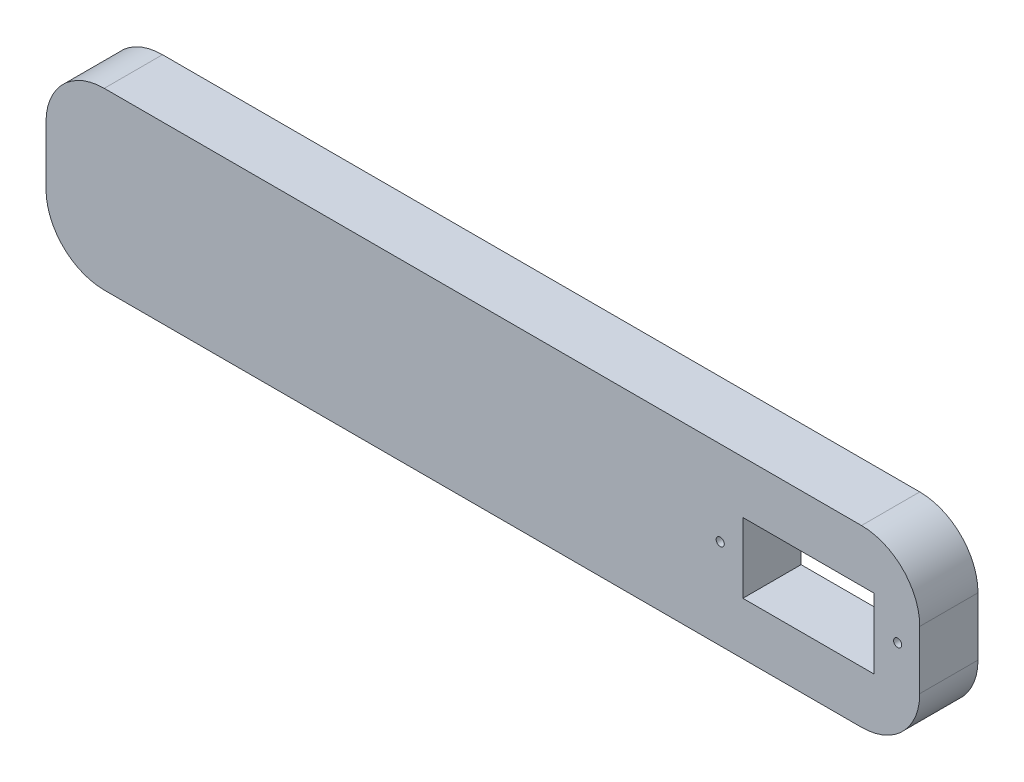
ISO-10303-21;
HEADER;
FILE_DESCRIPTION(('STEP AP214'),'2;1');
FILE_NAME('part.step','',(''),(''),'','','');
FILE_SCHEMA(('AUTOMOTIVE_DESIGN { 1 0 10303 214 1 1 1 1 }'));
ENDSEC;
DATA;
#1=APPLICATION_CONTEXT('core data for automotive mechanical design processes');
#2=APPLICATION_PROTOCOL_DEFINITION('international standard','automotive_design',2000,#1);
#3=PRODUCT_CONTEXT('',#1,'mechanical');
#4=PRODUCT('Part','Part','',(#3));
#5=PRODUCT_RELATED_PRODUCT_CATEGORY('part','',(#4));
#6=PRODUCT_DEFINITION_FORMATION('','',#4);
#7=PRODUCT_DEFINITION_CONTEXT('part definition',#1,'design');
#8=PRODUCT_DEFINITION('design','',#6,#7);
#9=PRODUCT_DEFINITION_SHAPE('','',#8);
#10=(LENGTH_UNIT() NAMED_UNIT(*) SI_UNIT(.MILLI.,.METRE.));
#11=(NAMED_UNIT(*) PLANE_ANGLE_UNIT() SI_UNIT($,.RADIAN.));
#12=(NAMED_UNIT(*) SI_UNIT($,.STERADIAN.) SOLID_ANGLE_UNIT());
#13=UNCERTAINTY_MEASURE_WITH_UNIT(LENGTH_MEASURE(1.E-05),#10,'distance_accuracy_value','');
#14=(GEOMETRIC_REPRESENTATION_CONTEXT(3) GLOBAL_UNCERTAINTY_ASSIGNED_CONTEXT((#13)) GLOBAL_UNIT_ASSIGNED_CONTEXT((#10,
#11,#12)) REPRESENTATION_CONTEXT('',''));
#15=CARTESIAN_POINT('',(0.,0.,0.));
#16=DIRECTION('',(0.,0.,1.));
#17=DIRECTION('',(1.,0.,0.));
#18=AXIS2_PLACEMENT_3D('',#15,#16,#17);
#19=CARTESIAN_POINT('',(10.,10.,10.));
#20=DIRECTION('',(0.,0.,-1.));
#21=DIRECTION('',(-1.,0.,0.));
#22=AXIS2_PLACEMENT_3D('',#19,#20,#21);
#23=CYLINDRICAL_SURFACE('',#22,10.);
#24=CARTESIAN_POINT('',(10.,10.,0.));
#25=DIRECTION('',(0.,0.,-1.));
#26=DIRECTION('',(-1.,0.,0.));
#27=AXIS2_PLACEMENT_3D('',#24,#25,#26);
#28=CIRCLE('',#27,10.);
#29=CARTESIAN_POINT('',(10.0000000000001,0.,0.));
#30=VERTEX_POINT('',#29);
#31=CARTESIAN_POINT('',(0.,10.0000000000001,0.));
#32=VERTEX_POINT('',#31);
#33=EDGE_CURVE('E163',#30,#32,#28,.T.);
#34=ORIENTED_EDGE('',*,*,#33,.F.);
#35=DIRECTION('',(0.,0.,-1.));
#36=VECTOR('',#35,1.);
#37=CARTESIAN_POINT('',(10.0000000000001,0.,10.));
#38=LINE('',#37,#36);
#39=CARTESIAN_POINT('',(10.0000000000001,0.,10.));
#40=VERTEX_POINT('',#39);
#41=EDGE_CURVE('E11',#40,#30,#38,.T.);
#42=ORIENTED_EDGE('',*,*,#41,.F.);
#43=CARTESIAN_POINT('',(10.,10.,10.));
#44=DIRECTION('',(0.,0.,-1.));
#45=DIRECTION('',(-1.,0.,0.));
#46=AXIS2_PLACEMENT_3D('',#43,#44,#45);
#47=CIRCLE('',#46,10.);
#48=CARTESIAN_POINT('',(0.,10.0000000000001,10.));
#49=VERTEX_POINT('',#48);
#50=EDGE_CURVE('E169',#40,#49,#47,.T.);
#51=ORIENTED_EDGE('',*,*,#50,.T.);
#52=DIRECTION('',(0.,0.,-1.));
#53=VECTOR('',#52,1.);
#54=CARTESIAN_POINT('',(0.,10.0000000000001,10.));
#55=LINE('',#54,#53);
#56=EDGE_CURVE('E45',#49,#32,#55,.T.);
#57=ORIENTED_EDGE('',*,*,#56,.T.);
#58=EDGE_LOOP('',(#34,#42,#51,#57));
#59=FACE_BOUND('',#58,.T.);
#60=ADVANCED_FACE('F39',(#59),#23,.T.);
#61=CARTESIAN_POINT('',(10.0000000000001,0.,10.));
#62=DIRECTION('',(0.,1.,0.));
#63=DIRECTION('',(0.,0.,1.));
#64=AXIS2_PLACEMENT_3D('',#61,#62,#63);
#65=PLANE('',#64);
#66=DIRECTION('',(1.,0.,0.));
#67=VECTOR('',#66,1.);
#68=CARTESIAN_POINT('',(10.0000000000001,0.,0.));
#69=LINE('',#68,#67);
#70=CARTESIAN_POINT('',(140.,0.,0.));
#71=VERTEX_POINT('',#70);
#72=EDGE_CURVE('E175',#30,#71,#69,.T.);
#73=ORIENTED_EDGE('',*,*,#72,.T.);
#74=DIRECTION('',(0.,0.,-1.));
#75=VECTOR('',#74,1.);
#76=CARTESIAN_POINT('',(140.,0.,10.));
#77=LINE('',#76,#75);
#78=CARTESIAN_POINT('',(140.,0.,10.));
#79=VERTEX_POINT('',#78);
#80=EDGE_CURVE('E50',#79,#71,#77,.T.);
#81=ORIENTED_EDGE('',*,*,#80,.F.);
#82=DIRECTION('',(1.,0.,0.));
#83=VECTOR('',#82,1.);
#84=CARTESIAN_POINT('',(10.0000000000001,0.,10.));
#85=LINE('',#84,#83);
#86=EDGE_CURVE('E187',#40,#79,#85,.T.);
#87=ORIENTED_EDGE('',*,*,#86,.F.);
#88=ORIENTED_EDGE('',*,*,#41,.T.);
#89=EDGE_LOOP('',(#73,#81,#87,#88));
#90=FACE_BOUND('',#89,.T.);
#91=ADVANCED_FACE('F237',(#90),#65,.F.);
#92=CARTESIAN_POINT('',(140.,10.,10.));
#93=DIRECTION('',(0.,0.,-1.));
#94=DIRECTION('',(-1.,0.,0.));
#95=AXIS2_PLACEMENT_3D('',#92,#93,#94);
#96=CYLINDRICAL_SURFACE('',#95,10.);
#97=CARTESIAN_POINT('',(140.,10.,0.));
#98=DIRECTION('',(0.,0.,1.));
#99=DIRECTION('',(1.,0.,0.));
#100=AXIS2_PLACEMENT_3D('',#97,#98,#99);
#101=CIRCLE('',#100,10.);
#102=CARTESIAN_POINT('',(150.,10.0000000000001,0.));
#103=VERTEX_POINT('',#102);
#104=EDGE_CURVE('E210',#71,#103,#101,.T.);
#105=ORIENTED_EDGE('',*,*,#104,.T.);
#106=DIRECTION('',(0.,0.,-1.));
#107=VECTOR('',#106,1.);
#108=CARTESIAN_POINT('',(150.,10.0000000000001,10.));
#109=LINE('',#108,#107);
#110=CARTESIAN_POINT('',(150.,10.0000000000001,10.));
#111=VERTEX_POINT('',#110);
#112=EDGE_CURVE('E215',#111,#103,#109,.T.);
#113=ORIENTED_EDGE('',*,*,#112,.F.);
#114=CARTESIAN_POINT('',(140.,10.,10.));
#115=DIRECTION('',(0.,0.,1.));
#116=DIRECTION('',(1.,0.,0.));
#117=AXIS2_PLACEMENT_3D('',#114,#115,#116);
#118=CIRCLE('',#117,10.);
#119=EDGE_CURVE('E186',#79,#111,#118,.T.);
#120=ORIENTED_EDGE('',*,*,#119,.F.);
#121=ORIENTED_EDGE('',*,*,#80,.T.);
#122=EDGE_LOOP('',(#105,#113,#120,#121));
#123=FACE_BOUND('',#122,.T.);
#124=ADVANCED_FACE('F238',(#123),#96,.T.);
#125=CARTESIAN_POINT('',(150.,10.0000000000001,10.));
#126=DIRECTION('',(-1.,0.,0.));
#127=DIRECTION('',(0.,0.,1.));
#128=AXIS2_PLACEMENT_3D('',#125,#126,#127);
#129=PLANE('',#128);
#130=DIRECTION('',(0.,1.,0.));
#131=VECTOR('',#130,1.);
#132=CARTESIAN_POINT('',(150.,10.0000000000001,0.));
#133=LINE('',#132,#131);
#134=CARTESIAN_POINT('',(150.,20.,0.));
#135=VERTEX_POINT('',#134);
#136=EDGE_CURVE('E204',#103,#135,#133,.T.);
#137=ORIENTED_EDGE('',*,*,#136,.T.);
#138=DIRECTION('',(0.,0.,-1.));
#139=VECTOR('',#138,1.);
#140=CARTESIAN_POINT('',(150.,20.,10.));
#141=LINE('',#140,#139);
#142=CARTESIAN_POINT('',(150.,20.,10.));
#143=VERTEX_POINT('',#142);
#144=EDGE_CURVE('E214',#143,#135,#141,.T.);
#145=ORIENTED_EDGE('',*,*,#144,.F.);
#146=DIRECTION('',(0.,1.,0.));
#147=VECTOR('',#146,1.);
#148=CARTESIAN_POINT('',(150.,10.0000000000001,10.));
#149=LINE('',#148,#147);
#150=EDGE_CURVE('E184',#111,#143,#149,.T.);
#151=ORIENTED_EDGE('',*,*,#150,.F.);
#152=ORIENTED_EDGE('',*,*,#112,.T.);
#153=EDGE_LOOP('',(#137,#145,#151,#152));
#154=FACE_BOUND('',#153,.T.);
#155=ADVANCED_FACE('F258',(#154),#129,.F.);
#156=CARTESIAN_POINT('',(140.,20.,10.));
#157=DIRECTION('',(0.,0.,-1.));
#158=DIRECTION('',(-1.,0.,0.));
#159=AXIS2_PLACEMENT_3D('',#156,#157,#158);
#160=CYLINDRICAL_SURFACE('',#159,10.);
#161=CARTESIAN_POINT('',(140.,20.,0.));
#162=DIRECTION('',(0.,0.,-1.));
#163=DIRECTION('',(-1.,0.,0.));
#164=AXIS2_PLACEMENT_3D('',#161,#162,#163);
#165=CIRCLE('',#164,10.);
#166=CARTESIAN_POINT('',(140.,30.,0.));
#167=VERTEX_POINT('',#166);
#168=EDGE_CURVE('E203',#167,#135,#165,.T.);
#169=ORIENTED_EDGE('',*,*,#168,.F.);
#170=DIRECTION('',(0.,0.,-1.));
#171=VECTOR('',#170,1.);
#172=CARTESIAN_POINT('',(140.,30.,10.));
#173=LINE('',#172,#171);
#174=CARTESIAN_POINT('',(140.,30.,10.));
#175=VERTEX_POINT('',#174);
#176=EDGE_CURVE('E220',#175,#167,#173,.T.);
#177=ORIENTED_EDGE('',*,*,#176,.F.);
#178=CARTESIAN_POINT('',(140.,20.,10.));
#179=DIRECTION('',(0.,0.,-1.));
#180=DIRECTION('',(-1.,0.,0.));
#181=AXIS2_PLACEMENT_3D('',#178,#179,#180);
#182=CIRCLE('',#181,10.);
#183=EDGE_CURVE('E182',#175,#143,#182,.T.);
#184=ORIENTED_EDGE('',*,*,#183,.T.);
#185=ORIENTED_EDGE('',*,*,#144,.T.);
#186=EDGE_LOOP('',(#169,#177,#184,#185));
#187=FACE_BOUND('',#186,.T.);
#188=ADVANCED_FACE('F255',(#187),#160,.T.);
#189=CARTESIAN_POINT('',(10.,30.,10.));
#190=DIRECTION('',(0.,1.,0.));
#191=DIRECTION('',(0.,0.,1.));
#192=AXIS2_PLACEMENT_3D('',#189,#190,#191);
#193=PLANE('',#192);
#194=DIRECTION('',(1.,0.,0.));
#195=VECTOR('',#194,1.);
#196=CARTESIAN_POINT('',(10.,30.,0.));
#197=LINE('',#196,#195);
#198=CARTESIAN_POINT('',(10.,30.,0.));
#199=VERTEX_POINT('',#198);
#200=EDGE_CURVE('E196',#199,#167,#197,.T.);
#201=ORIENTED_EDGE('',*,*,#200,.F.);
#202=DIRECTION('',(0.,0.,-1.));
#203=VECTOR('',#202,1.);
#204=CARTESIAN_POINT('',(10.,30.,10.));
#205=LINE('',#204,#203);
#206=CARTESIAN_POINT('',(10.,30.,10.));
#207=VERTEX_POINT('',#206);
#208=EDGE_CURVE('E218',#207,#199,#205,.T.);
#209=ORIENTED_EDGE('',*,*,#208,.F.);
#210=DIRECTION('',(1.,0.,0.));
#211=VECTOR('',#210,1.);
#212=CARTESIAN_POINT('',(10.,30.,10.));
#213=LINE('',#212,#211);
#214=EDGE_CURVE('E179',#207,#175,#213,.T.);
#215=ORIENTED_EDGE('',*,*,#214,.T.);
#216=ORIENTED_EDGE('',*,*,#176,.T.);
#217=EDGE_LOOP('',(#201,#209,#215,#216));
#218=FACE_BOUND('',#217,.T.);
#219=ADVANCED_FACE('F252',(#218),#193,.T.);
#220=CARTESIAN_POINT('',(10.,20.,10.));
#221=DIRECTION('',(0.,0.,-1.));
#222=DIRECTION('',(-1.,0.,0.));
#223=AXIS2_PLACEMENT_3D('',#220,#221,#222);
#224=CYLINDRICAL_SURFACE('',#223,10.);
#225=CARTESIAN_POINT('',(10.,20.,0.));
#226=DIRECTION('',(0.,0.,-1.));
#227=DIRECTION('',(-1.,0.,0.));
#228=AXIS2_PLACEMENT_3D('',#225,#226,#227);
#229=CIRCLE('',#228,10.);
#230=CARTESIAN_POINT('',(0.,20.,0.));
#231=VERTEX_POINT('',#230);
#232=EDGE_CURVE('E195',#231,#199,#229,.T.);
#233=ORIENTED_EDGE('',*,*,#232,.F.);
#234=DIRECTION('',(0.,0.,-1.));
#235=VECTOR('',#234,1.);
#236=CARTESIAN_POINT('',(0.,20.,10.));
#237=LINE('',#236,#235);
#238=CARTESIAN_POINT('',(0.,20.,10.));
#239=VERTEX_POINT('',#238);
#240=EDGE_CURVE('E219',#239,#231,#237,.T.);
#241=ORIENTED_EDGE('',*,*,#240,.F.);
#242=CARTESIAN_POINT('',(10.,20.,10.));
#243=DIRECTION('',(0.,0.,-1.));
#244=DIRECTION('',(-1.,0.,0.));
#245=AXIS2_PLACEMENT_3D('',#242,#243,#244);
#246=CIRCLE('',#245,10.);
#247=EDGE_CURVE('E174',#239,#207,#246,.T.);
#248=ORIENTED_EDGE('',*,*,#247,.T.);
#249=ORIENTED_EDGE('',*,*,#208,.T.);
#250=EDGE_LOOP('',(#233,#241,#248,#249));
#251=FACE_BOUND('',#250,.T.);
#252=ADVANCED_FACE('F249',(#251),#224,.T.);
#253=CARTESIAN_POINT('',(0.,10.0000000000001,10.));
#254=DIRECTION('',(-1.,0.,0.));
#255=DIRECTION('',(0.,-1.,0.));
#256=AXIS2_PLACEMENT_3D('',#253,#254,#255);
#257=PLANE('',#256);
#258=DIRECTION('',(0.,1.,0.));
#259=VECTOR('',#258,1.);
#260=CARTESIAN_POINT('',(0.,10.0000000000001,0.));
#261=LINE('',#260,#259);
#262=EDGE_CURVE('E192',#32,#231,#261,.T.);
#263=ORIENTED_EDGE('',*,*,#262,.F.);
#264=ORIENTED_EDGE('',*,*,#56,.F.);
#265=DIRECTION('',(0.,1.,0.));
#266=VECTOR('',#265,1.);
#267=CARTESIAN_POINT('',(0.,10.0000000000001,10.));
#268=LINE('',#267,#266);
#269=EDGE_CURVE('E171',#49,#239,#268,.T.);
#270=ORIENTED_EDGE('',*,*,#269,.T.);
#271=ORIENTED_EDGE('',*,*,#240,.T.);
#272=EDGE_LOOP('',(#263,#264,#270,#271));
#273=FACE_BOUND('',#272,.T.);
#274=ADVANCED_FACE('F227',(#273),#257,.T.);
#275=CARTESIAN_POINT('',(10.,10.,10.));
#276=DIRECTION('',(0.,0.,-1.));
#277=DIRECTION('',(-1.,0.,0.));
#278=AXIS2_PLACEMENT_3D('',#275,#276,#277);
#279=PLANE('',#278);
#280=CARTESIAN_POINT('',(146.209359197237,15.6683609351606,10.));
#281=DIRECTION('',(0.,0.,-1.));
#282=DIRECTION('',(-1.,0.,0.));
#283=AXIS2_PLACEMENT_3D('',#280,#281,#282);
#284=CIRCLE('',#283,0.698499999999991);
#285=CARTESIAN_POINT('',(145.510859197237,15.6683609351606,10.));
#286=VERTEX_POINT('',#285);
#287=EDGE_CURVE('E327',#286,#286,#284,.T.);
#288=ORIENTED_EDGE('',*,*,#287,.T.);
#289=EDGE_LOOP('',(#288));
#290=FACE_BOUND('',#289,.T.);
#291=CARTESIAN_POINT('',(115.743972014608,15.4538159550012,10.));
#292=DIRECTION('',(0.,0.,-1.));
#293=DIRECTION('',(-1.,0.,0.));
#294=AXIS2_PLACEMENT_3D('',#291,#292,#293);
#295=CIRCLE('',#294,0.698499999999991);
#296=CARTESIAN_POINT('',(115.045472014608,15.4538159550012,10.));
#297=VERTEX_POINT('',#296);
#298=EDGE_CURVE('E155',#297,#297,#295,.T.);
#299=ORIENTED_EDGE('',*,*,#298,.T.);
#300=EDGE_LOOP('',(#299));
#301=FACE_BOUND('',#300,.T.);
#302=DIRECTION('',(1.,0.,0.));
#303=VECTOR('',#302,1.);
#304=CARTESIAN_POINT('',(142.152658662093,21.0165694682676,10.));
#305=LINE('',#304,#303);
#306=CARTESIAN_POINT('',(119.632658662093,21.0165694682676,10.));
#307=VERTEX_POINT('',#306);
#308=CARTESIAN_POINT('',(142.152658662093,21.0165694682676,10.));
#309=VERTEX_POINT('',#308);
#310=EDGE_CURVE('E136',#307,#309,#305,.T.);
#311=ORIENTED_EDGE('',*,*,#310,.T.);
#312=DIRECTION('',(0.,-1.,0.));
#313=VECTOR('',#312,1.);
#314=CARTESIAN_POINT('',(142.152658662093,8.99656946826759,10.));
#315=LINE('',#314,#313);
#316=CARTESIAN_POINT('',(142.152658662093,8.99656946826759,10.));
#317=VERTEX_POINT('',#316);
#318=EDGE_CURVE('E128',#309,#317,#315,.T.);
#319=ORIENTED_EDGE('',*,*,#318,.T.);
#320=DIRECTION('',(-1.,0.,0.));
#321=VECTOR('',#320,1.);
#322=CARTESIAN_POINT('',(142.152658662093,8.99656946826759,10.));
#323=LINE('',#322,#321);
#324=CARTESIAN_POINT('',(119.632658662093,8.99656946826759,10.));
#325=VERTEX_POINT('',#324);
#326=EDGE_CURVE('E138',#317,#325,#323,.T.);
#327=ORIENTED_EDGE('',*,*,#326,.T.);
#328=DIRECTION('',(0.,1.,0.));
#329=VECTOR('',#328,1.);
#330=CARTESIAN_POINT('',(119.632658662093,8.99656946826759,10.));
#331=LINE('',#330,#329);
#332=EDGE_CURVE('E54',#325,#307,#331,.T.);
#333=ORIENTED_EDGE('',*,*,#332,.T.);
#334=EDGE_LOOP('',(#311,#319,#327,#333));
#335=FACE_BOUND('',#334,.T.);
#336=ORIENTED_EDGE('',*,*,#50,.F.);
#337=ORIENTED_EDGE('',*,*,#86,.T.);
#338=ORIENTED_EDGE('',*,*,#119,.T.);
#339=ORIENTED_EDGE('',*,*,#150,.T.);
#340=ORIENTED_EDGE('',*,*,#183,.F.);
#341=ORIENTED_EDGE('',*,*,#214,.F.);
#342=ORIENTED_EDGE('',*,*,#247,.F.);
#343=ORIENTED_EDGE('',*,*,#269,.F.);
#344=EDGE_LOOP('',(#336,#337,#338,#339,#340,#341,#342,#343));
#345=FACE_BOUND('',#344,.T.);
#346=ADVANCED_FACE('F141',(#290,#301,#335,#345),#279,.F.);
#347=CARTESIAN_POINT('',(10.,10.,0.));
#348=DIRECTION('',(0.,0.,-1.));
#349=DIRECTION('',(-1.,0.,0.));
#350=AXIS2_PLACEMENT_3D('',#347,#348,#349);
#351=PLANE('',#350);
#352=CARTESIAN_POINT('',(146.209359197237,15.6683609351606,0.));
#353=DIRECTION('',(0.,0.,-1.));
#354=DIRECTION('',(-1.,0.,0.));
#355=AXIS2_PLACEMENT_3D('',#352,#353,#354);
#356=CIRCLE('',#355,1.58749999999999);
#357=CARTESIAN_POINT('',(144.621859197237,15.6683609351606,0.));
#358=VERTEX_POINT('',#357);
#359=EDGE_CURVE('E321',#358,#358,#356,.T.);
#360=ORIENTED_EDGE('',*,*,#359,.F.);
#361=EDGE_LOOP('',(#360));
#362=FACE_BOUND('',#361,.T.);
#363=CARTESIAN_POINT('',(115.743972014608,15.4538159550012,0.));
#364=DIRECTION('',(0.,0.,-1.));
#365=DIRECTION('',(-1.,0.,0.));
#366=AXIS2_PLACEMENT_3D('',#363,#364,#365);
#367=CIRCLE('',#366,1.58749999999999);
#368=CARTESIAN_POINT('',(114.156472014608,15.4538159550012,0.));
#369=VERTEX_POINT('',#368);
#370=EDGE_CURVE('E332',#369,#369,#367,.T.);
#371=ORIENTED_EDGE('',*,*,#370,.F.);
#372=EDGE_LOOP('',(#371));
#373=FACE_BOUND('',#372,.T.);
#374=DIRECTION('',(0.,-1.,0.));
#375=VECTOR('',#374,1.);
#376=CARTESIAN_POINT('',(142.152658662093,8.99656946826759,0.));
#377=LINE('',#376,#375);
#378=CARTESIAN_POINT('',(142.152658662093,21.0165694682676,0.));
#379=VERTEX_POINT('',#378);
#380=CARTESIAN_POINT('',(142.152658662093,8.99656946826759,0.));
#381=VERTEX_POINT('',#380);
#382=EDGE_CURVE('E62',#379,#381,#377,.T.);
#383=ORIENTED_EDGE('',*,*,#382,.F.);
#384=DIRECTION('',(1.,0.,0.));
#385=VECTOR('',#384,1.);
#386=CARTESIAN_POINT('',(142.152658662093,21.0165694682676,0.));
#387=LINE('',#386,#385);
#388=CARTESIAN_POINT('',(119.632658662093,21.0165694682676,0.));
#389=VERTEX_POINT('',#388);
#390=EDGE_CURVE('E148',#389,#379,#387,.T.);
#391=ORIENTED_EDGE('',*,*,#390,.F.);
#392=DIRECTION('',(0.,1.,0.));
#393=VECTOR('',#392,1.);
#394=CARTESIAN_POINT('',(119.632658662093,8.99656946826759,0.));
#395=LINE('',#394,#393);
#396=CARTESIAN_POINT('',(119.632658662093,8.99656946826759,0.));
#397=VERTEX_POINT('',#396);
#398=EDGE_CURVE('E149',#397,#389,#395,.T.);
#399=ORIENTED_EDGE('',*,*,#398,.F.);
#400=DIRECTION('',(-1.,0.,0.));
#401=VECTOR('',#400,1.);
#402=CARTESIAN_POINT('',(142.152658662093,8.99656946826759,0.));
#403=LINE('',#402,#401);
#404=EDGE_CURVE('E158',#381,#397,#403,.T.);
#405=ORIENTED_EDGE('',*,*,#404,.F.);
#406=EDGE_LOOP('',(#383,#391,#399,#405));
#407=FACE_BOUND('',#406,.T.);
#408=ORIENTED_EDGE('',*,*,#33,.T.);
#409=ORIENTED_EDGE('',*,*,#262,.T.);
#410=ORIENTED_EDGE('',*,*,#232,.T.);
#411=ORIENTED_EDGE('',*,*,#200,.T.);
#412=ORIENTED_EDGE('',*,*,#168,.T.);
#413=ORIENTED_EDGE('',*,*,#136,.F.);
#414=ORIENTED_EDGE('',*,*,#104,.F.);
#415=ORIENTED_EDGE('',*,*,#72,.F.);
#416=EDGE_LOOP('',(#408,#409,#410,#411,#412,#413,#414,#415));
#417=FACE_BOUND('',#416,.T.);
#418=ADVANCED_FACE('F231',(#362,#373,#407,#417),#351,.T.);
#419=CARTESIAN_POINT('',(142.152658662093,8.99656946826759,10.));
#420=DIRECTION('',(1.,0.,0.));
#421=DIRECTION('',(0.,0.,-1.));
#422=AXIS2_PLACEMENT_3D('',#419,#420,#421);
#423=PLANE('',#422);
#424=ORIENTED_EDGE('',*,*,#382,.T.);
#425=DIRECTION('',(0.,0.,-1.));
#426=VECTOR('',#425,1.);
#427=CARTESIAN_POINT('',(142.152658662093,8.99656946826759,10.));
#428=LINE('',#427,#426);
#429=EDGE_CURVE('E127',#317,#381,#428,.T.);
#430=ORIENTED_EDGE('',*,*,#429,.F.);
#431=ORIENTED_EDGE('',*,*,#318,.F.);
#432=DIRECTION('',(0.,0.,-1.));
#433=VECTOR('',#432,1.);
#434=CARTESIAN_POINT('',(142.152658662093,21.0165694682676,10.));
#435=LINE('',#434,#433);
#436=EDGE_CURVE('E165',#309,#379,#435,.T.);
#437=ORIENTED_EDGE('',*,*,#436,.T.);
#438=EDGE_LOOP('',(#424,#430,#431,#437));
#439=FACE_BOUND('',#438,.T.);
#440=ADVANCED_FACE('F126',(#439),#423,.F.);
#441=CARTESIAN_POINT('',(142.152658662093,21.0165694682676,10.));
#442=DIRECTION('',(0.,1.,0.));
#443=DIRECTION('',(0.,0.,1.));
#444=AXIS2_PLACEMENT_3D('',#441,#442,#443);
#445=PLANE('',#444);
#446=ORIENTED_EDGE('',*,*,#390,.T.);
#447=ORIENTED_EDGE('',*,*,#436,.F.);
#448=ORIENTED_EDGE('',*,*,#310,.F.);
#449=DIRECTION('',(0.,0.,-1.));
#450=VECTOR('',#449,1.);
#451=CARTESIAN_POINT('',(119.632658662093,21.0165694682676,10.));
#452=LINE('',#451,#450);
#453=EDGE_CURVE('E164',#307,#389,#452,.T.);
#454=ORIENTED_EDGE('',*,*,#453,.T.);
#455=EDGE_LOOP('',(#446,#447,#448,#454));
#456=FACE_BOUND('',#455,.T.);
#457=ADVANCED_FACE('F281',(#456),#445,.F.);
#458=CARTESIAN_POINT('',(119.632658662093,8.99656946826759,10.));
#459=DIRECTION('',(-1.,0.,0.));
#460=DIRECTION('',(0.,0.,1.));
#461=AXIS2_PLACEMENT_3D('',#458,#459,#460);
#462=PLANE('',#461);
#463=ORIENTED_EDGE('',*,*,#398,.T.);
#464=ORIENTED_EDGE('',*,*,#453,.F.);
#465=ORIENTED_EDGE('',*,*,#332,.F.);
#466=DIRECTION('',(0.,0.,-1.));
#467=VECTOR('',#466,1.);
#468=CARTESIAN_POINT('',(119.632658662093,8.99656946826759,10.));
#469=LINE('',#468,#467);
#470=EDGE_CURVE('E134',#325,#397,#469,.T.);
#471=ORIENTED_EDGE('',*,*,#470,.T.);
#472=EDGE_LOOP('',(#463,#464,#465,#471));
#473=FACE_BOUND('',#472,.T.);
#474=ADVANCED_FACE('F284',(#473),#462,.F.);
#475=CARTESIAN_POINT('',(142.152658662093,8.99656946826759,10.));
#476=DIRECTION('',(0.,-1.,0.));
#477=DIRECTION('',(0.,0.,-1.));
#478=AXIS2_PLACEMENT_3D('',#475,#476,#477);
#479=PLANE('',#478);
#480=ORIENTED_EDGE('',*,*,#404,.T.);
#481=ORIENTED_EDGE('',*,*,#470,.F.);
#482=ORIENTED_EDGE('',*,*,#326,.F.);
#483=ORIENTED_EDGE('',*,*,#429,.T.);
#484=EDGE_LOOP('',(#480,#481,#482,#483));
#485=FACE_BOUND('',#484,.T.);
#486=ADVANCED_FACE('F140',(#485),#479,.F.);
#487=CARTESIAN_POINT('',(115.743972014608,15.4538159550012,0.));
#488=DIRECTION('',(0.,0.,-1.));
#489=DIRECTION('',(-1.,0.,0.));
#490=AXIS2_PLACEMENT_3D('',#487,#488,#489);
#491=CYLINDRICAL_SURFACE('',#490,0.698499999999998);
#492=ORIENTED_EDGE('',*,*,#298,.F.);
#493=EDGE_LOOP('',(#492));
#494=FACE_BOUND('',#493,.T.);
#495=CARTESIAN_POINT('',(115.743972014608,15.4538159550012,0.711199999999999));
#496=DIRECTION('',(0.,0.,-1.));
#497=DIRECTION('',(-1.,0.,0.));
#498=AXIS2_PLACEMENT_3D('',#495,#496,#497);
#499=CIRCLE('',#498,0.698500000000005);
#500=CARTESIAN_POINT('',(115.045472014608,15.4538159550012,0.711199999999999));
#501=VERTEX_POINT('',#500);
#502=EDGE_CURVE('E336',#501,#501,#499,.T.);
#503=ORIENTED_EDGE('',*,*,#502,.T.);
#504=EDGE_LOOP('',(#503));
#505=FACE_BOUND('',#504,.T.);
#506=ADVANCED_FACE('F283',(#494,#505),#491,.F.);
#507=CARTESIAN_POINT('',(116.442472014608,15.4538159550012,0.711199999999999));
#508=DIRECTION('',(0.,0.,1.));
#509=DIRECTION('',(1.,0.,0.));
#510=AXIS2_PLACEMENT_3D('',#507,#508,#509);
#511=PLANE('',#510);
#512=ORIENTED_EDGE('',*,*,#502,.F.);
#513=EDGE_LOOP('',(#512));
#514=FACE_BOUND('',#513,.T.);
#515=CARTESIAN_POINT('',(115.743972014608,15.4538159550012,0.711199999999999));
#516=DIRECTION('',(0.,0.,-1.));
#517=DIRECTION('',(-1.,0.,0.));
#518=AXIS2_PLACEMENT_3D('',#515,#516,#517);
#519=CIRCLE('',#518,1.58749999999999);
#520=CARTESIAN_POINT('',(114.156472014608,15.4538159550012,0.711199999999999));
#521=VERTEX_POINT('',#520);
#522=EDGE_CURVE('E331',#521,#521,#519,.T.);
#523=ORIENTED_EDGE('',*,*,#522,.T.);
#524=EDGE_LOOP('',(#523));
#525=FACE_BOUND('',#524,.T.);
#526=ADVANCED_FACE('F291',(#514,#525),#511,.F.);
#527=CARTESIAN_POINT('',(115.743972014608,15.4538159550012,0.));
#528=DIRECTION('',(0.,0.,-1.));
#529=DIRECTION('',(-1.,0.,0.));
#530=AXIS2_PLACEMENT_3D('',#527,#528,#529);
#531=CYLINDRICAL_SURFACE('',#530,1.58749999999999);
#532=ORIENTED_EDGE('',*,*,#522,.F.);
#533=EDGE_LOOP('',(#532));
#534=FACE_BOUND('',#533,.T.);
#535=ORIENTED_EDGE('',*,*,#370,.T.);
#536=EDGE_LOOP('',(#535));
#537=FACE_BOUND('',#536,.T.);
#538=ADVANCED_FACE('F300',(#534,#537),#531,.F.);
#539=CARTESIAN_POINT('',(146.209359197237,15.6683609351606,0.));
#540=DIRECTION('',(0.,0.,-1.));
#541=DIRECTION('',(-1.,0.,0.));
#542=AXIS2_PLACEMENT_3D('',#539,#540,#541);
#543=CYLINDRICAL_SURFACE('',#542,0.698499999999991);
#544=ORIENTED_EDGE('',*,*,#287,.F.);
#545=EDGE_LOOP('',(#544));
#546=FACE_BOUND('',#545,.T.);
#547=CARTESIAN_POINT('',(146.209359197237,15.6683609351606,0.711199999999999));
#548=DIRECTION('',(0.,0.,-1.));
#549=DIRECTION('',(-1.,0.,0.));
#550=AXIS2_PLACEMENT_3D('',#547,#548,#549);
#551=CIRCLE('',#550,0.698499999999991);
#552=CARTESIAN_POINT('',(145.510859197237,15.6683609351606,0.711199999999999));
#553=VERTEX_POINT('',#552);
#554=EDGE_CURVE('E323',#553,#553,#551,.T.);
#555=ORIENTED_EDGE('',*,*,#554,.T.);
#556=EDGE_LOOP('',(#555));
#557=FACE_BOUND('',#556,.T.);
#558=ADVANCED_FACE('F301',(#546,#557),#543,.F.);
#559=CARTESIAN_POINT('',(146.907859197237,15.6683609351606,0.711199999999999));
#560=DIRECTION('',(0.,0.,1.));
#561=DIRECTION('',(1.,0.,0.));
#562=AXIS2_PLACEMENT_3D('',#559,#560,#561);
#563=PLANE('',#562);
#564=ORIENTED_EDGE('',*,*,#554,.F.);
#565=EDGE_LOOP('',(#564));
#566=FACE_BOUND('',#565,.T.);
#567=CARTESIAN_POINT('',(146.209359197237,15.6683609351606,0.711199999999999));
#568=DIRECTION('',(0.,0.,-1.));
#569=DIRECTION('',(-1.,0.,0.));
#570=AXIS2_PLACEMENT_3D('',#567,#568,#569);
#571=CIRCLE('',#570,1.58749999999999);
#572=CARTESIAN_POINT('',(144.621859197237,15.6683609351606,0.711199999999999));
#573=VERTEX_POINT('',#572);
#574=EDGE_CURVE('E318',#573,#573,#571,.T.);
#575=ORIENTED_EDGE('',*,*,#574,.T.);
#576=EDGE_LOOP('',(#575));
#577=FACE_BOUND('',#576,.T.);
#578=ADVANCED_FACE('F305',(#566,#577),#563,.F.);
#579=CARTESIAN_POINT('',(146.209359197237,15.6683609351606,0.));
#580=DIRECTION('',(0.,0.,-1.));
#581=DIRECTION('',(-1.,0.,0.));
#582=AXIS2_PLACEMENT_3D('',#579,#580,#581);
#583=CYLINDRICAL_SURFACE('',#582,1.58749999999999);
#584=ORIENTED_EDGE('',*,*,#574,.F.);
#585=EDGE_LOOP('',(#584));
#586=FACE_BOUND('',#585,.T.);
#587=ORIENTED_EDGE('',*,*,#359,.T.);
#588=EDGE_LOOP('',(#587));
#589=FACE_BOUND('',#588,.T.);
#590=ADVANCED_FACE('F310',(#586,#589),#583,.F.);
#591=CLOSED_SHELL('',(#60,#91,#124,#155,#188,#219,#252,#274,#346,#418,#440,#457,#474,#486,#506,
#526,#538,#558,#578,#590));
#592=MANIFOLD_SOLID_BREP('B2',#591);
#593=ADVANCED_BREP_SHAPE_REPRESENTATION('',(#18,#592),#14);
#594=SHAPE_DEFINITION_REPRESENTATION(#9,#593);
ENDSEC;
END-ISO-10303-21;
